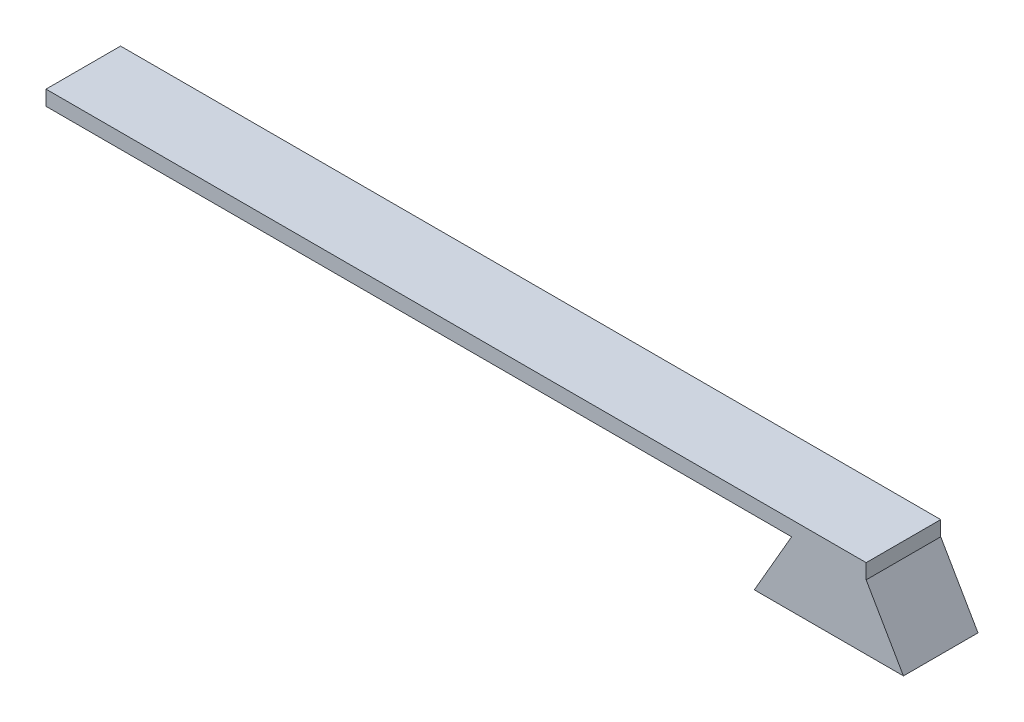
ISO-10303-21;
HEADER;
FILE_DESCRIPTION(('STEP AP214'),'2;1');
FILE_NAME('part.step','',(''),(''),'','','');
FILE_SCHEMA(('AUTOMOTIVE_DESIGN { 1 0 10303 214 1 1 1 1 }'));
ENDSEC;
DATA;
#1=APPLICATION_CONTEXT('core data for automotive mechanical design processes');
#2=APPLICATION_PROTOCOL_DEFINITION('international standard','automotive_design',2000,#1);
#3=PRODUCT_CONTEXT('',#1,'mechanical');
#4=PRODUCT('Part','Part','',(#3));
#5=PRODUCT_RELATED_PRODUCT_CATEGORY('part','',(#4));
#6=PRODUCT_DEFINITION_FORMATION('','',#4);
#7=PRODUCT_DEFINITION_CONTEXT('part definition',#1,'design');
#8=PRODUCT_DEFINITION('design','',#6,#7);
#9=PRODUCT_DEFINITION_SHAPE('','',#8);
#10=(LENGTH_UNIT() NAMED_UNIT(*) SI_UNIT(.MILLI.,.METRE.));
#11=(NAMED_UNIT(*) PLANE_ANGLE_UNIT() SI_UNIT($,.RADIAN.));
#12=(NAMED_UNIT(*) SI_UNIT($,.STERADIAN.) SOLID_ANGLE_UNIT());
#13=UNCERTAINTY_MEASURE_WITH_UNIT(LENGTH_MEASURE(1.E-05),#10,'distance_accuracy_value','');
#14=(GEOMETRIC_REPRESENTATION_CONTEXT(3) GLOBAL_UNCERTAINTY_ASSIGNED_CONTEXT((#13)) GLOBAL_UNIT_ASSIGNED_CONTEXT((#10,
#11,#12)) REPRESENTATION_CONTEXT('',''));
#15=CARTESIAN_POINT('',(0.,0.,0.));
#16=DIRECTION('',(0.,0.,1.));
#17=DIRECTION('',(1.,0.,0.));
#18=AXIS2_PLACEMENT_3D('',#15,#16,#17);
#19=CARTESIAN_POINT('',(200.,0.,100.));
#20=DIRECTION('',(0.,1.,0.));
#21=DIRECTION('',(0.,0.,1.));
#22=AXIS2_PLACEMENT_3D('',#19,#20,#21);
#23=PLANE('',#22);
#24=DIRECTION('',(1.,0.,0.));
#25=VECTOR('',#24,1.);
#26=CARTESIAN_POINT('',(200.,0.,0.));
#27=LINE('',#26,#25);
#28=CARTESIAN_POINT('',(0.,0.,0.));
#29=VERTEX_POINT('',#28);
#30=CARTESIAN_POINT('',(200.,0.,0.));
#31=VERTEX_POINT('',#30);
#32=EDGE_CURVE('E98',#29,#31,#27,.T.);
#33=ORIENTED_EDGE('',*,*,#32,.T.);
#34=DIRECTION('',(0.,0.,-1.));
#35=VECTOR('',#34,1.);
#36=CARTESIAN_POINT('',(200.,0.,100.));
#37=LINE('',#36,#35);
#38=CARTESIAN_POINT('',(200.,0.,100.));
#39=VERTEX_POINT('',#38);
#40=EDGE_CURVE('E11',#39,#31,#37,.T.);
#41=ORIENTED_EDGE('',*,*,#40,.F.);
#42=DIRECTION('',(1.,0.,0.));
#43=VECTOR('',#42,1.);
#44=CARTESIAN_POINT('',(200.,0.,100.));
#45=LINE('',#44,#43);
#46=CARTESIAN_POINT('',(0.,0.,100.));
#47=VERTEX_POINT('',#46);
#48=EDGE_CURVE('E90',#47,#39,#45,.T.);
#49=ORIENTED_EDGE('',*,*,#48,.F.);
#50=DIRECTION('',(0.,0.,-1.));
#51=VECTOR('',#50,1.);
#52=CARTESIAN_POINT('',(0.,0.,100.));
#53=LINE('',#52,#51);
#54=EDGE_CURVE('E99',#47,#29,#53,.T.);
#55=ORIENTED_EDGE('',*,*,#54,.T.);
#56=EDGE_LOOP('',(#33,#41,#49,#55));
#57=FACE_BOUND('',#56,.T.);
#58=ADVANCED_FACE('F35',(#57),#23,.F.);
#59=CARTESIAN_POINT('',(150.,86.6025403784443,100.));
#60=DIRECTION('',(-0.86602540378444,-0.499999999999998,0.));
#61=DIRECTION('',(0.499999999999998,-0.86602540378444,0.));
#62=AXIS2_PLACEMENT_3D('',#59,#60,#61);
#63=PLANE('',#62);
#64=DIRECTION('',(-0.499999999999998,0.86602540378444,0.));
#65=VECTOR('',#64,1.);
#66=CARTESIAN_POINT('',(150.,86.6025403784443,0.));
#67=LINE('',#66,#65);
#68=CARTESIAN_POINT('',(150.,86.6025403784443,0.));
#69=VERTEX_POINT('',#68);
#70=EDGE_CURVE('E64',#31,#69,#67,.T.);
#71=ORIENTED_EDGE('',*,*,#70,.T.);
#72=DIRECTION('',(0.,0.,-1.));
#73=VECTOR('',#72,1.);
#74=CARTESIAN_POINT('',(150.,86.6025403784443,100.));
#75=LINE('',#74,#73);
#76=CARTESIAN_POINT('',(150.,86.6025403784443,100.));
#77=VERTEX_POINT('',#76);
#78=EDGE_CURVE('E43',#77,#69,#75,.T.);
#79=ORIENTED_EDGE('',*,*,#78,.F.);
#80=DIRECTION('',(-0.499999999999998,0.86602540378444,0.));
#81=VECTOR('',#80,1.);
#82=CARTESIAN_POINT('',(150.,86.6025403784443,100.));
#83=LINE('',#82,#81);
#84=EDGE_CURVE('E83',#39,#77,#83,.T.);
#85=ORIENTED_EDGE('',*,*,#84,.F.);
#86=ORIENTED_EDGE('',*,*,#40,.T.);
#87=EDGE_LOOP('',(#71,#79,#85,#86));
#88=FACE_BOUND('',#87,.T.);
#89=ADVANCED_FACE('F84',(#88),#63,.F.);
#90=CARTESIAN_POINT('',(0.,0.,100.));
#91=DIRECTION('',(0.86602540378444,-0.499999999999998,0.));
#92=DIRECTION('',(0.499999999999998,0.86602540378444,0.));
#93=AXIS2_PLACEMENT_3D('',#90,#91,#92);
#94=PLANE('',#93);
#95=DIRECTION('',(-0.499999999999998,-0.86602540378444,0.));
#96=VECTOR('',#95,1.);
#97=CARTESIAN_POINT('',(0.,0.,0.));
#98=LINE('',#97,#96);
#99=CARTESIAN_POINT('',(50.,86.6025403784443,0.));
#100=VERTEX_POINT('',#99);
#101=EDGE_CURVE('E96',#100,#29,#98,.T.);
#102=ORIENTED_EDGE('',*,*,#101,.T.);
#103=ORIENTED_EDGE('',*,*,#54,.F.);
#104=DIRECTION('',(-0.499999999999998,-0.86602540378444,0.));
#105=VECTOR('',#104,1.);
#106=CARTESIAN_POINT('',(0.,0.,100.));
#107=LINE('',#106,#105);
#108=CARTESIAN_POINT('',(50.,86.6025403784443,100.));
#109=VERTEX_POINT('',#108);
#110=EDGE_CURVE('E51',#109,#47,#107,.T.);
#111=ORIENTED_EDGE('',*,*,#110,.F.);
#112=DIRECTION('',(0.,0.,-1.));
#113=VECTOR('',#112,1.);
#114=CARTESIAN_POINT('',(50.,86.6025403784443,100.));
#115=LINE('',#114,#113);
#116=EDGE_CURVE('E110',#109,#100,#115,.T.);
#117=ORIENTED_EDGE('',*,*,#116,.T.);
#118=EDGE_LOOP('',(#102,#103,#111,#117));
#119=FACE_BOUND('',#118,.T.);
#120=ADVANCED_FACE('F156',(#119),#94,.F.);
#121=CARTESIAN_POINT('',(0.,0.,100.));
#122=DIRECTION('',(0.,0.,-1.));
#123=DIRECTION('',(-1.,0.,0.));
#124=AXIS2_PLACEMENT_3D('',#121,#122,#123);
#125=PLANE('',#124);
#126=ORIENTED_EDGE('',*,*,#48,.T.);
#127=ORIENTED_EDGE('',*,*,#84,.T.);
#128=DIRECTION('',(0.,-1.,0.));
#129=VECTOR('',#128,1.);
#130=CARTESIAN_POINT('',(150.,106.602540378444,100.));
#131=LINE('',#130,#129);
#132=CARTESIAN_POINT('',(150.,106.602540378444,100.));
#133=VERTEX_POINT('',#132);
#134=EDGE_CURVE('E101',#133,#77,#131,.T.);
#135=ORIENTED_EDGE('',*,*,#134,.F.);
#136=DIRECTION('',(1.,0.,0.));
#137=VECTOR('',#136,1.);
#138=CARTESIAN_POINT('',(50.,106.602540378444,100.));
#139=LINE('',#138,#137);
#140=CARTESIAN_POINT('',(-950.,106.602540378444,100.));
#141=VERTEX_POINT('',#140);
#142=EDGE_CURVE('E122',#141,#133,#139,.T.);
#143=ORIENTED_EDGE('',*,*,#142,.F.);
#144=DIRECTION('',(0.,1.,0.));
#145=VECTOR('',#144,1.);
#146=CARTESIAN_POINT('',(-950.,106.602540378444,100.));
#147=LINE('',#146,#145);
#148=CARTESIAN_POINT('',(-950.,86.6025403784443,100.));
#149=VERTEX_POINT('',#148);
#150=EDGE_CURVE('E132',#149,#141,#147,.T.);
#151=ORIENTED_EDGE('',*,*,#150,.F.);
#152=DIRECTION('',(1.,0.,0.));
#153=VECTOR('',#152,1.);
#154=CARTESIAN_POINT('',(-950.,86.6025403784443,100.));
#155=LINE('',#154,#153);
#156=EDGE_CURVE('E127',#149,#109,#155,.T.);
#157=ORIENTED_EDGE('',*,*,#156,.T.);
#158=ORIENTED_EDGE('',*,*,#110,.T.);
#159=EDGE_LOOP('',(#126,#127,#135,#143,#151,#157,#158));
#160=FACE_BOUND('',#159,.T.);
#161=ADVANCED_FACE('F93',(#160),#125,.F.);
#162=CARTESIAN_POINT('',(0.,0.,0.));
#163=DIRECTION('',(0.,0.,-1.));
#164=DIRECTION('',(-1.,0.,0.));
#165=AXIS2_PLACEMENT_3D('',#162,#163,#164);
#166=PLANE('',#165);
#167=ORIENTED_EDGE('',*,*,#32,.F.);
#168=ORIENTED_EDGE('',*,*,#101,.F.);
#169=DIRECTION('',(1.,0.,0.));
#170=VECTOR('',#169,1.);
#171=CARTESIAN_POINT('',(-950.,86.6025403784443,0.));
#172=LINE('',#171,#170);
#173=CARTESIAN_POINT('',(-950.,86.6025403784443,0.));
#174=VERTEX_POINT('',#173);
#175=EDGE_CURVE('E124',#174,#100,#172,.T.);
#176=ORIENTED_EDGE('',*,*,#175,.F.);
#177=DIRECTION('',(0.,-1.,0.));
#178=VECTOR('',#177,1.);
#179=CARTESIAN_POINT('',(-950.,106.602540378444,0.));
#180=LINE('',#179,#178);
#181=CARTESIAN_POINT('',(-950.,106.602540378444,0.));
#182=VERTEX_POINT('',#181);
#183=EDGE_CURVE('E138',#182,#174,#180,.T.);
#184=ORIENTED_EDGE('',*,*,#183,.F.);
#185=DIRECTION('',(-1.,0.,0.));
#186=VECTOR('',#185,1.);
#187=CARTESIAN_POINT('',(50.,106.602540378444,0.));
#188=LINE('',#187,#186);
#189=CARTESIAN_POINT('',(150.,106.602540378444,0.));
#190=VERTEX_POINT('',#189);
#191=EDGE_CURVE('E117',#190,#182,#188,.T.);
#192=ORIENTED_EDGE('',*,*,#191,.F.);
#193=DIRECTION('',(0.,-1.,0.));
#194=VECTOR('',#193,1.);
#195=CARTESIAN_POINT('',(150.,106.602540378444,0.));
#196=LINE('',#195,#194);
#197=EDGE_CURVE('E104',#190,#69,#196,.T.);
#198=ORIENTED_EDGE('',*,*,#197,.T.);
#199=ORIENTED_EDGE('',*,*,#70,.F.);
#200=EDGE_LOOP('',(#167,#168,#176,#184,#192,#198,#199));
#201=FACE_BOUND('',#200,.T.);
#202=ADVANCED_FACE('F115',(#201),#166,.T.);
#203=CARTESIAN_POINT('',(150.,106.602540378444,0.));
#204=DIRECTION('',(-1.,0.,0.));
#205=DIRECTION('',(0.,0.,1.));
#206=AXIS2_PLACEMENT_3D('',#203,#204,#205);
#207=PLANE('',#206);
#208=ORIENTED_EDGE('',*,*,#78,.T.);
#209=ORIENTED_EDGE('',*,*,#197,.F.);
#210=DIRECTION('',(0.,0.,-1.));
#211=VECTOR('',#210,1.);
#212=CARTESIAN_POINT('',(150.,106.602540378444,0.));
#213=LINE('',#212,#211);
#214=EDGE_CURVE('E73',#133,#190,#213,.T.);
#215=ORIENTED_EDGE('',*,*,#214,.F.);
#216=ORIENTED_EDGE('',*,*,#134,.T.);
#217=EDGE_LOOP('',(#208,#209,#215,#216));
#218=FACE_BOUND('',#217,.T.);
#219=ADVANCED_FACE('F113',(#218),#207,.F.);
#220=CARTESIAN_POINT('',(0.,106.602540378444,0.));
#221=DIRECTION('',(0.,1.,0.));
#222=DIRECTION('',(0.,0.,1.));
#223=AXIS2_PLACEMENT_3D('',#220,#221,#222);
#224=PLANE('',#223);
#225=ORIENTED_EDGE('',*,*,#191,.T.);
#226=DIRECTION('',(0.,0.,-1.));
#227=VECTOR('',#226,1.);
#228=CARTESIAN_POINT('',(-950.,106.602540378444,0.));
#229=LINE('',#228,#227);
#230=EDGE_CURVE('E129',#141,#182,#229,.T.);
#231=ORIENTED_EDGE('',*,*,#230,.F.);
#232=ORIENTED_EDGE('',*,*,#142,.T.);
#233=ORIENTED_EDGE('',*,*,#214,.T.);
#234=EDGE_LOOP('',(#225,#231,#232,#233));
#235=FACE_BOUND('',#234,.T.);
#236=ADVANCED_FACE('F163',(#235),#224,.T.);
#237=CARTESIAN_POINT('',(-950.,86.6025403784443,0.));
#238=DIRECTION('',(0.,1.,0.));
#239=DIRECTION('',(0.,0.,1.));
#240=AXIS2_PLACEMENT_3D('',#237,#238,#239);
#241=PLANE('',#240);
#242=ORIENTED_EDGE('',*,*,#116,.F.);
#243=ORIENTED_EDGE('',*,*,#156,.F.);
#244=DIRECTION('',(0.,0.,1.));
#245=VECTOR('',#244,1.);
#246=CARTESIAN_POINT('',(-950.,86.6025403784443,0.));
#247=LINE('',#246,#245);
#248=EDGE_CURVE('E135',#174,#149,#247,.T.);
#249=ORIENTED_EDGE('',*,*,#248,.F.);
#250=ORIENTED_EDGE('',*,*,#175,.T.);
#251=EDGE_LOOP('',(#242,#243,#249,#250));
#252=FACE_BOUND('',#251,.T.);
#253=ADVANCED_FACE('F153',(#252),#241,.F.);
#254=CARTESIAN_POINT('',(-950.,0.,0.));
#255=DIRECTION('',(-1.,0.,0.));
#256=DIRECTION('',(0.,0.,1.));
#257=AXIS2_PLACEMENT_3D('',#254,#255,#256);
#258=PLANE('',#257);
#259=ORIENTED_EDGE('',*,*,#183,.T.);
#260=ORIENTED_EDGE('',*,*,#248,.T.);
#261=ORIENTED_EDGE('',*,*,#150,.T.);
#262=ORIENTED_EDGE('',*,*,#230,.T.);
#263=EDGE_LOOP('',(#259,#260,#261,#262));
#264=FACE_BOUND('',#263,.T.);
#265=ADVANCED_FACE('F143',(#264),#258,.T.);
#266=CLOSED_SHELL('',(#58,#89,#120,#161,#202,#219,#236,#253,#265));
#267=MANIFOLD_SOLID_BREP('B2',#266);
#268=ADVANCED_BREP_SHAPE_REPRESENTATION('',(#18,#267),#14);
#269=SHAPE_DEFINITION_REPRESENTATION(#9,#268);
ENDSEC;
END-ISO-10303-21;
